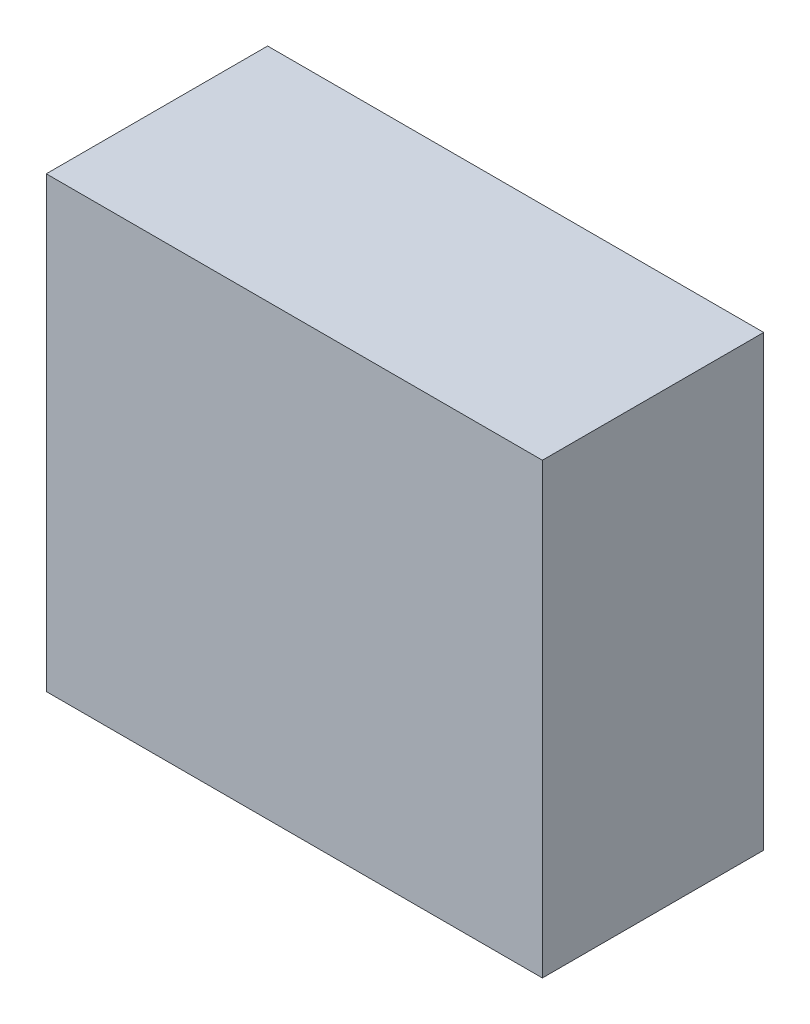
ISO-10303-21;
HEADER;
FILE_DESCRIPTION(('STEP AP214'),'2;1');
FILE_NAME('part.step','',(''),(''),'','','');
FILE_SCHEMA(('AUTOMOTIVE_DESIGN { 1 0 10303 214 1 1 1 1 }'));
ENDSEC;
DATA;
#1=APPLICATION_CONTEXT('core data for automotive mechanical design processes');
#2=APPLICATION_PROTOCOL_DEFINITION('international standard','automotive_design',2000,#1);
#3=PRODUCT_CONTEXT('',#1,'mechanical');
#4=PRODUCT('Part','Part','',(#3));
#5=PRODUCT_RELATED_PRODUCT_CATEGORY('part','',(#4));
#6=PRODUCT_DEFINITION_FORMATION('','',#4);
#7=PRODUCT_DEFINITION_CONTEXT('part definition',#1,'design');
#8=PRODUCT_DEFINITION('design','',#6,#7);
#9=PRODUCT_DEFINITION_SHAPE('','',#8);
#10=(LENGTH_UNIT() NAMED_UNIT(*) SI_UNIT(.MILLI.,.METRE.));
#11=(NAMED_UNIT(*) PLANE_ANGLE_UNIT() SI_UNIT($,.RADIAN.));
#12=(NAMED_UNIT(*) SI_UNIT($,.STERADIAN.) SOLID_ANGLE_UNIT());
#13=UNCERTAINTY_MEASURE_WITH_UNIT(LENGTH_MEASURE(1.E-05),#10,'distance_accuracy_value','');
#14=(GEOMETRIC_REPRESENTATION_CONTEXT(3) GLOBAL_UNCERTAINTY_ASSIGNED_CONTEXT((#13)) GLOBAL_UNIT_ASSIGNED_CONTEXT((#10,
#11,#12)) REPRESENTATION_CONTEXT('',''));
#15=CARTESIAN_POINT('',(0.,0.,0.));
#16=DIRECTION('',(0.,0.,1.));
#17=DIRECTION('',(1.,0.,0.));
#18=AXIS2_PLACEMENT_3D('',#15,#16,#17);
#19=CARTESIAN_POINT('',(-5.19999976,4.70000076,4.64000088));
#20=DIRECTION('',(0.,0.,1.));
#21=DIRECTION('',(1.,0.,0.));
#22=AXIS2_PLACEMENT_3D('',#19,#20,#21);
#23=PLANE('',#22);
#24=DIRECTION('',(0.,1.,0.));
#25=VECTOR('',#24,1.);
#26=CARTESIAN_POINT('',(5.19999976,4.70000076,4.64000088));
#27=LINE('',#26,#25);
#28=CARTESIAN_POINT('',(5.19999976,4.70000076,4.64000088));
#29=VERTEX_POINT('',#28);
#30=CARTESIAN_POINT('',(5.19999976,-4.70000076,4.64000088));
#31=VERTEX_POINT('',#30);
#32=EDGE_CURVE('E53',#29,#31,#27,.F.);
#33=ORIENTED_EDGE('',*,*,#32,.F.);
#34=DIRECTION('',(1.,0.,0.));
#35=VECTOR('',#34,1.);
#36=CARTESIAN_POINT('',(-5.19999976,4.70000076,4.64000088));
#37=LINE('',#36,#35);
#38=CARTESIAN_POINT('',(-5.19999976,4.70000076,4.64000088));
#39=VERTEX_POINT('',#38);
#40=EDGE_CURVE('E68',#39,#29,#37,.T.);
#41=ORIENTED_EDGE('',*,*,#40,.F.);
#42=DIRECTION('',(0.,1.,0.));
#43=VECTOR('',#42,1.);
#44=CARTESIAN_POINT('',(-5.19999976,-4.70000076,4.64000088));
#45=LINE('',#44,#43);
#46=CARTESIAN_POINT('',(-5.19999976,-4.70000076,4.64000088));
#47=VERTEX_POINT('',#46);
#48=EDGE_CURVE('E20',#47,#39,#45,.T.);
#49=ORIENTED_EDGE('',*,*,#48,.F.);
#50=DIRECTION('',(1.,0.,0.));
#51=VECTOR('',#50,1.);
#52=CARTESIAN_POINT('',(5.19999976,-4.70000076,4.64000088));
#53=LINE('',#52,#51);
#54=EDGE_CURVE('E58',#31,#47,#53,.F.);
#55=ORIENTED_EDGE('',*,*,#54,.F.);
#56=EDGE_LOOP('',(#33,#41,#49,#55));
#57=FACE_BOUND('',#56,.T.);
#58=ADVANCED_FACE('F17',(#57),#23,.T.);
#59=CARTESIAN_POINT('',(-5.19999976,-4.70000076,0.));
#60=DIRECTION('',(-1.,0.,0.));
#61=DIRECTION('',(0.,0.,1.));
#62=AXIS2_PLACEMENT_3D('',#59,#60,#61);
#63=PLANE('',#62);
#64=DIRECTION('',(0.,0.,1.));
#65=VECTOR('',#64,1.);
#66=CARTESIAN_POINT('',(-5.19999976,4.70000076,0.));
#67=LINE('',#66,#65);
#68=CARTESIAN_POINT('',(-5.19999976,4.70000076,0.));
#69=VERTEX_POINT('',#68);
#70=EDGE_CURVE('E79',#69,#39,#67,.T.);
#71=ORIENTED_EDGE('',*,*,#70,.F.);
#72=DIRECTION('',(0.,1.,0.));
#73=VECTOR('',#72,1.);
#74=CARTESIAN_POINT('',(-5.19999976,4.70000076,0.));
#75=LINE('',#74,#73);
#76=CARTESIAN_POINT('',(-5.19999976,-4.70000076,0.));
#77=VERTEX_POINT('',#76);
#78=EDGE_CURVE('E74',#69,#77,#75,.F.);
#79=ORIENTED_EDGE('',*,*,#78,.T.);
#80=DIRECTION('',(0.,0.,-1.));
#81=VECTOR('',#80,1.);
#82=CARTESIAN_POINT('',(-5.19999976,-4.70000076,0.));
#83=LINE('',#82,#81);
#84=EDGE_CURVE('E63',#47,#77,#83,.T.);
#85=ORIENTED_EDGE('',*,*,#84,.F.);
#86=ORIENTED_EDGE('',*,*,#48,.T.);
#87=EDGE_LOOP('',(#71,#79,#85,#86));
#88=FACE_BOUND('',#87,.T.);
#89=ADVANCED_FACE('F73',(#88),#63,.T.);
#90=CARTESIAN_POINT('',(5.19999976,-4.70000076,0.));
#91=DIRECTION('',(0.,-1.,0.));
#92=DIRECTION('',(0.,0.,-1.));
#93=AXIS2_PLACEMENT_3D('',#90,#91,#92);
#94=PLANE('',#93);
#95=ORIENTED_EDGE('',*,*,#84,.T.);
#96=DIRECTION('',(1.,0.,0.));
#97=VECTOR('',#96,1.);
#98=CARTESIAN_POINT('',(-5.19999976,-4.70000076,0.));
#99=LINE('',#98,#97);
#100=CARTESIAN_POINT('',(5.19999976,-4.70000076,0.));
#101=VERTEX_POINT('',#100);
#102=EDGE_CURVE('E84',#77,#101,#99,.T.);
#103=ORIENTED_EDGE('',*,*,#102,.T.);
#104=DIRECTION('',(0.,0.,-1.));
#105=VECTOR('',#104,1.);
#106=CARTESIAN_POINT('',(5.19999976,-4.70000076,0.));
#107=LINE('',#106,#105);
#108=EDGE_CURVE('E65',#31,#101,#107,.T.);
#109=ORIENTED_EDGE('',*,*,#108,.F.);
#110=ORIENTED_EDGE('',*,*,#54,.T.);
#111=EDGE_LOOP('',(#95,#103,#109,#110));
#112=FACE_BOUND('',#111,.T.);
#113=ADVANCED_FACE('F60',(#112),#94,.T.);
#114=CARTESIAN_POINT('',(5.19999976,4.70000076,0.));
#115=DIRECTION('',(1.,0.,0.));
#116=DIRECTION('',(0.,0.,-1.));
#117=AXIS2_PLACEMENT_3D('',#114,#115,#116);
#118=PLANE('',#117);
#119=ORIENTED_EDGE('',*,*,#108,.T.);
#120=DIRECTION('',(0.,1.,0.));
#121=VECTOR('',#120,1.);
#122=CARTESIAN_POINT('',(5.19999976,4.70000076,0.));
#123=LINE('',#122,#121);
#124=CARTESIAN_POINT('',(5.19999976,4.70000076,0.));
#125=VERTEX_POINT('',#124);
#126=EDGE_CURVE('E26',#101,#125,#123,.T.);
#127=ORIENTED_EDGE('',*,*,#126,.T.);
#128=DIRECTION('',(0.,0.,1.));
#129=VECTOR('',#128,1.);
#130=CARTESIAN_POINT('',(5.19999976,4.70000076,0.));
#131=LINE('',#130,#129);
#132=EDGE_CURVE('E34',#29,#125,#131,.F.);
#133=ORIENTED_EDGE('',*,*,#132,.F.);
#134=ORIENTED_EDGE('',*,*,#32,.T.);
#135=EDGE_LOOP('',(#119,#127,#133,#134));
#136=FACE_BOUND('',#135,.T.);
#137=ADVANCED_FACE('F88',(#136),#118,.T.);
#138=CARTESIAN_POINT('',(-5.19999976,4.70000076,0.));
#139=DIRECTION('',(0.,1.,0.));
#140=DIRECTION('',(0.,0.,1.));
#141=AXIS2_PLACEMENT_3D('',#138,#139,#140);
#142=PLANE('',#141);
#143=ORIENTED_EDGE('',*,*,#132,.T.);
#144=DIRECTION('',(1.,0.,0.));
#145=VECTOR('',#144,1.);
#146=CARTESIAN_POINT('',(-5.19999976,4.70000076,0.));
#147=LINE('',#146,#145);
#148=EDGE_CURVE('E11',#125,#69,#147,.F.);
#149=ORIENTED_EDGE('',*,*,#148,.T.);
#150=ORIENTED_EDGE('',*,*,#70,.T.);
#151=ORIENTED_EDGE('',*,*,#40,.T.);
#152=EDGE_LOOP('',(#143,#149,#150,#151));
#153=FACE_BOUND('',#152,.T.);
#154=ADVANCED_FACE('F91',(#153),#142,.T.);
#155=CARTESIAN_POINT('',(-5.19999976,4.70000076,0.));
#156=DIRECTION('',(0.,0.,1.));
#157=DIRECTION('',(1.,0.,0.));
#158=AXIS2_PLACEMENT_3D('',#155,#156,#157);
#159=PLANE('',#158);
#160=ORIENTED_EDGE('',*,*,#126,.F.);
#161=ORIENTED_EDGE('',*,*,#102,.F.);
#162=ORIENTED_EDGE('',*,*,#78,.F.);
#163=ORIENTED_EDGE('',*,*,#148,.F.);
#164=EDGE_LOOP('',(#160,#161,#162,#163));
#165=FACE_BOUND('',#164,.T.);
#166=ADVANCED_FACE('F90',(#165),#159,.F.);
#167=CLOSED_SHELL('',(#58,#89,#113,#137,#154,#166));
#168=MANIFOLD_SOLID_BREP('B1',#167);
#169=ADVANCED_BREP_SHAPE_REPRESENTATION('',(#18,#168),#14);
#170=SHAPE_DEFINITION_REPRESENTATION(#9,#169);
ENDSEC;
END-ISO-10303-21;
